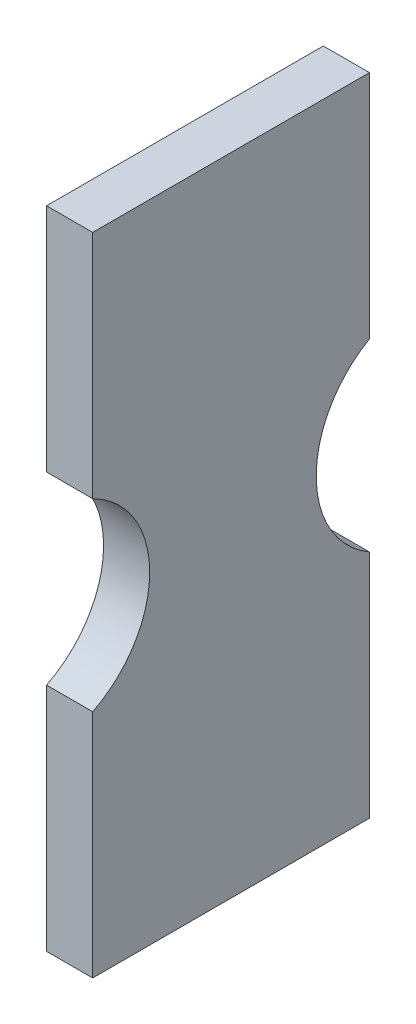
ISO-10303-21;
HEADER;
FILE_DESCRIPTION(('STEP AP214'),'2;1');
FILE_NAME('part.step','',(''),(''),'','','');
FILE_SCHEMA(('AUTOMOTIVE_DESIGN { 1 0 10303 214 1 1 1 1 }'));
ENDSEC;
DATA;
#1=APPLICATION_CONTEXT('core data for automotive mechanical design processes');
#2=APPLICATION_PROTOCOL_DEFINITION('international standard','automotive_design',2000,#1);
#3=PRODUCT_CONTEXT('',#1,'mechanical');
#4=PRODUCT('Part','Part','',(#3));
#5=PRODUCT_RELATED_PRODUCT_CATEGORY('part','',(#4));
#6=PRODUCT_DEFINITION_FORMATION('','',#4);
#7=PRODUCT_DEFINITION_CONTEXT('part definition',#1,'design');
#8=PRODUCT_DEFINITION('design','',#6,#7);
#9=PRODUCT_DEFINITION_SHAPE('','',#8);
#10=(LENGTH_UNIT() NAMED_UNIT(*) SI_UNIT(.MILLI.,.METRE.));
#11=(NAMED_UNIT(*) PLANE_ANGLE_UNIT() SI_UNIT($,.RADIAN.));
#12=(NAMED_UNIT(*) SI_UNIT($,.STERADIAN.) SOLID_ANGLE_UNIT());
#13=UNCERTAINTY_MEASURE_WITH_UNIT(LENGTH_MEASURE(1.E-05),#10,'distance_accuracy_value','');
#14=(GEOMETRIC_REPRESENTATION_CONTEXT(3) GLOBAL_UNCERTAINTY_ASSIGNED_CONTEXT((#13)) GLOBAL_UNIT_ASSIGNED_CONTEXT((#10,
#11,#12)) REPRESENTATION_CONTEXT('',''));
#15=CARTESIAN_POINT('',(0.,0.,0.));
#16=DIRECTION('',(0.,0.,1.));
#17=DIRECTION('',(1.,0.,0.));
#18=AXIS2_PLACEMENT_3D('',#15,#16,#17);
#19=CARTESIAN_POINT('',(6.35,0.,0.));
#20=DIRECTION('',(0.,0.,1.));
#21=DIRECTION('',(1.,0.,0.));
#22=AXIS2_PLACEMENT_3D('',#19,#20,#21);
#23=PLANE('',#22);
#24=DIRECTION('',(0.,1.,0.));
#25=VECTOR('',#24,1.);
#26=CARTESIAN_POINT('',(0.,0.,0.));
#27=LINE('',#26,#25);
#28=CARTESIAN_POINT('',(0.,0.,0.));
#29=VERTEX_POINT('',#28);
#30=CARTESIAN_POINT('',(0.,31.75,0.));
#31=VERTEX_POINT('',#30);
#32=EDGE_CURVE('E140',#29,#31,#27,.T.);
#33=ORIENTED_EDGE('',*,*,#32,.T.);
#34=DIRECTION('',(1.,0.,0.));
#35=VECTOR('',#34,1.);
#36=CARTESIAN_POINT('',(0.,31.75,0.));
#37=LINE('',#36,#35);
#38=CARTESIAN_POINT('',(6.35,31.75,0.));
#39=VERTEX_POINT('',#38);
#40=EDGE_CURVE('E61',#31,#39,#37,.T.);
#41=ORIENTED_EDGE('',*,*,#40,.T.);
#42=DIRECTION('',(0.,1.,0.));
#43=VECTOR('',#42,1.);
#44=CARTESIAN_POINT('',(6.35,0.,0.));
#45=LINE('',#44,#43);
#46=CARTESIAN_POINT('',(6.35,0.,0.));
#47=VERTEX_POINT('',#46);
#48=EDGE_CURVE('E199',#47,#39,#45,.T.);
#49=ORIENTED_EDGE('',*,*,#48,.F.);
#50=DIRECTION('',(-1.,0.,0.));
#51=VECTOR('',#50,1.);
#52=CARTESIAN_POINT('',(6.35,0.,0.));
#53=LINE('',#52,#51);
#54=EDGE_CURVE('E11',#47,#29,#53,.T.);
#55=ORIENTED_EDGE('',*,*,#54,.T.);
#56=EDGE_LOOP('',(#33,#41,#49,#55));
#57=FACE_BOUND('',#56,.T.);
#58=ADVANCED_FACE('F45',(#57),#23,.F.);
#59=CARTESIAN_POINT('',(6.35,0.,38.1));
#60=DIRECTION('',(0.,0.,-1.));
#61=DIRECTION('',(-1.,0.,0.));
#62=AXIS2_PLACEMENT_3D('',#59,#60,#61);
#63=PLANE('',#62);
#64=DIRECTION('',(0.,-1.,0.));
#65=VECTOR('',#64,1.);
#66=CARTESIAN_POINT('',(0.,0.,38.1));
#67=LINE('',#66,#65);
#68=CARTESIAN_POINT('',(0.,88.9,38.1));
#69=VERTEX_POINT('',#68);
#70=CARTESIAN_POINT('',(0.,57.15,38.1));
#71=VERTEX_POINT('',#70);
#72=EDGE_CURVE('E134',#69,#71,#67,.T.);
#73=ORIENTED_EDGE('',*,*,#72,.T.);
#74=DIRECTION('',(1.,0.,0.));
#75=VECTOR('',#74,1.);
#76=CARTESIAN_POINT('',(0.,57.15,38.1));
#77=LINE('',#76,#75);
#78=CARTESIAN_POINT('',(6.35,57.15,38.1));
#79=VERTEX_POINT('',#78);
#80=EDGE_CURVE('E69',#71,#79,#77,.T.);
#81=ORIENTED_EDGE('',*,*,#80,.T.);
#82=DIRECTION('',(0.,-1.,0.));
#83=VECTOR('',#82,1.);
#84=CARTESIAN_POINT('',(6.35,0.,38.1));
#85=LINE('',#84,#83);
#86=CARTESIAN_POINT('',(6.35,88.9,38.1));
#87=VERTEX_POINT('',#86);
#88=EDGE_CURVE('E148',#87,#79,#85,.T.);
#89=ORIENTED_EDGE('',*,*,#88,.F.);
#90=DIRECTION('',(-1.,0.,0.));
#91=VECTOR('',#90,1.);
#92=CARTESIAN_POINT('',(6.35,88.9,38.1));
#93=LINE('',#92,#91);
#94=EDGE_CURVE('E147',#87,#69,#93,.T.);
#95=ORIENTED_EDGE('',*,*,#94,.T.);
#96=EDGE_LOOP('',(#73,#81,#89,#95));
#97=FACE_BOUND('',#96,.T.);
#98=ADVANCED_FACE('F165',(#97),#63,.F.);
#99=CARTESIAN_POINT('',(6.35,0.,0.));
#100=DIRECTION('',(0.,1.,0.));
#101=DIRECTION('',(0.,0.,1.));
#102=AXIS2_PLACEMENT_3D('',#99,#100,#101);
#103=PLANE('',#102);
#104=DIRECTION('',(0.,0.,-1.));
#105=VECTOR('',#104,1.);
#106=CARTESIAN_POINT('',(0.,0.,0.));
#107=LINE('',#106,#105);
#108=CARTESIAN_POINT('',(0.,0.,38.1));
#109=VERTEX_POINT('',#108);
#110=EDGE_CURVE('E128',#109,#29,#107,.T.);
#111=ORIENTED_EDGE('',*,*,#110,.T.);
#112=ORIENTED_EDGE('',*,*,#54,.F.);
#113=DIRECTION('',(0.,0.,-1.));
#114=VECTOR('',#113,1.);
#115=CARTESIAN_POINT('',(6.35,0.,0.));
#116=LINE('',#115,#114);
#117=CARTESIAN_POINT('',(6.35,0.,38.1));
#118=VERTEX_POINT('',#117);
#119=EDGE_CURVE('E139',#118,#47,#116,.T.);
#120=ORIENTED_EDGE('',*,*,#119,.F.);
#121=DIRECTION('',(-1.,0.,0.));
#122=VECTOR('',#121,1.);
#123=CARTESIAN_POINT('',(6.35,0.,38.1));
#124=LINE('',#123,#122);
#125=EDGE_CURVE('E144',#118,#109,#124,.T.);
#126=ORIENTED_EDGE('',*,*,#125,.T.);
#127=EDGE_LOOP('',(#111,#112,#120,#126));
#128=FACE_BOUND('',#127,.T.);
#129=ADVANCED_FACE('F47',(#128),#103,.F.);
#130=CARTESIAN_POINT('',(6.35,57.15,0.));
#131=VERTEX_POINT('',#130);
#132=CARTESIAN_POINT('',(6.35,88.9,0.));
#133=VERTEX_POINT('',#132);
#134=EDGE_CURVE('E183',#131,#133,#45,.T.);
#135=ORIENTED_EDGE('',*,*,#134,.F.);
#136=DIRECTION('',(1.,0.,0.));
#137=VECTOR('',#136,1.);
#138=CARTESIAN_POINT('',(0.,57.15,0.));
#139=LINE('',#138,#137);
#140=CARTESIAN_POINT('',(0.,57.15,0.));
#141=VERTEX_POINT('',#140);
#142=EDGE_CURVE('E182',#141,#131,#139,.T.);
#143=ORIENTED_EDGE('',*,*,#142,.F.);
#144=CARTESIAN_POINT('',(0.,88.9,0.));
#145=VERTEX_POINT('',#144);
#146=EDGE_CURVE('E163',#141,#145,#27,.T.);
#147=ORIENTED_EDGE('',*,*,#146,.T.);
#148=DIRECTION('',(-1.,0.,0.));
#149=VECTOR('',#148,1.);
#150=CARTESIAN_POINT('',(6.35,88.9,0.));
#151=LINE('',#150,#149);
#152=EDGE_CURVE('E54',#133,#145,#151,.T.);
#153=ORIENTED_EDGE('',*,*,#152,.F.);
#154=EDGE_LOOP('',(#135,#143,#147,#153));
#155=FACE_BOUND('',#154,.T.);
#156=ADVANCED_FACE('F181',(#155),#23,.F.);
#157=CARTESIAN_POINT('',(6.35,88.9,0.));
#158=DIRECTION('',(0.,-1.,0.));
#159=DIRECTION('',(0.,0.,-1.));
#160=AXIS2_PLACEMENT_3D('',#157,#158,#159);
#161=PLANE('',#160);
#162=DIRECTION('',(0.,0.,1.));
#163=VECTOR('',#162,1.);
#164=CARTESIAN_POINT('',(0.,88.9,0.));
#165=LINE('',#164,#163);
#166=EDGE_CURVE('E135',#145,#69,#165,.T.);
#167=ORIENTED_EDGE('',*,*,#166,.T.);
#168=ORIENTED_EDGE('',*,*,#94,.F.);
#169=DIRECTION('',(0.,0.,1.));
#170=VECTOR('',#169,1.);
#171=CARTESIAN_POINT('',(6.35,88.9,0.));
#172=LINE('',#171,#170);
#173=EDGE_CURVE('E159',#133,#87,#172,.T.);
#174=ORIENTED_EDGE('',*,*,#173,.F.);
#175=ORIENTED_EDGE('',*,*,#152,.T.);
#176=EDGE_LOOP('',(#167,#168,#174,#175));
#177=FACE_BOUND('',#176,.T.);
#178=ADVANCED_FACE('F157',(#177),#161,.F.);
#179=CARTESIAN_POINT('',(6.35,31.75,38.1));
#180=VERTEX_POINT('',#179);
#181=EDGE_CURVE('E126',#180,#118,#85,.T.);
#182=ORIENTED_EDGE('',*,*,#181,.F.);
#183=DIRECTION('',(1.,0.,0.));
#184=VECTOR('',#183,1.);
#185=CARTESIAN_POINT('',(0.,31.75,38.1));
#186=LINE('',#185,#184);
#187=CARTESIAN_POINT('',(0.,31.75,38.1));
#188=VERTEX_POINT('',#187);
#189=EDGE_CURVE('E111',#188,#180,#186,.T.);
#190=ORIENTED_EDGE('',*,*,#189,.F.);
#191=EDGE_CURVE('E124',#188,#109,#67,.T.);
#192=ORIENTED_EDGE('',*,*,#191,.T.);
#193=ORIENTED_EDGE('',*,*,#125,.F.);
#194=EDGE_LOOP('',(#182,#190,#192,#193));
#195=FACE_BOUND('',#194,.T.);
#196=ADVANCED_FACE('F122',(#195),#63,.F.);
#197=CARTESIAN_POINT('',(6.35,0.,0.));
#198=DIRECTION('',(-1.,0.,0.));
#199=DIRECTION('',(0.,0.,1.));
#200=AXIS2_PLACEMENT_3D('',#197,#198,#199);
#201=PLANE('',#200);
#202=ORIENTED_EDGE('',*,*,#88,.T.);
#203=CARTESIAN_POINT('',(6.35,44.45,44.45));
#204=DIRECTION('',(1.,0.,0.));
#205=DIRECTION('',(0.,0.,-1.));
#206=AXIS2_PLACEMENT_3D('',#203,#204,#205);
#207=CIRCLE('',#206,14.1990316571237);
#208=EDGE_CURVE('E118',#180,#79,#207,.T.);
#209=ORIENTED_EDGE('',*,*,#208,.F.);
#210=ORIENTED_EDGE('',*,*,#181,.T.);
#211=ORIENTED_EDGE('',*,*,#119,.T.);
#212=ORIENTED_EDGE('',*,*,#48,.T.);
#213=CARTESIAN_POINT('',(6.35,44.45,-7.34406322096139));
#214=DIRECTION('',(1.,0.,0.));
#215=DIRECTION('',(0.,0.,1.));
#216=AXIS2_PLACEMENT_3D('',#213,#214,#215);
#217=CIRCLE('',#216,14.6705577465029);
#218=EDGE_CURVE('E192',#131,#39,#217,.T.);
#219=ORIENTED_EDGE('',*,*,#218,.F.);
#220=ORIENTED_EDGE('',*,*,#134,.T.);
#221=ORIENTED_EDGE('',*,*,#173,.T.);
#222=EDGE_LOOP('',(#202,#209,#210,#211,#212,#219,#220,#221));
#223=FACE_BOUND('',#222,.T.);
#224=ADVANCED_FACE('F204',(#223),#201,.F.);
#225=CARTESIAN_POINT('',(0.,0.,0.));
#226=DIRECTION('',(-1.,0.,0.));
#227=DIRECTION('',(0.,0.,1.));
#228=AXIS2_PLACEMENT_3D('',#225,#226,#227);
#229=PLANE('',#228);
#230=CARTESIAN_POINT('',(0.,44.45,44.45));
#231=DIRECTION('',(1.,0.,0.));
#232=DIRECTION('',(0.,0.,-1.));
#233=AXIS2_PLACEMENT_3D('',#230,#231,#232);
#234=CIRCLE('',#233,14.1990316571237);
#235=EDGE_CURVE('E108',#188,#71,#234,.T.);
#236=ORIENTED_EDGE('',*,*,#235,.T.);
#237=ORIENTED_EDGE('',*,*,#72,.F.);
#238=ORIENTED_EDGE('',*,*,#166,.F.);
#239=ORIENTED_EDGE('',*,*,#146,.F.);
#240=CARTESIAN_POINT('',(0.,44.45,-7.34406322096139));
#241=DIRECTION('',(1.,0.,0.));
#242=DIRECTION('',(0.,0.,1.));
#243=AXIS2_PLACEMENT_3D('',#240,#241,#242);
#244=CIRCLE('',#243,14.6705577465029);
#245=EDGE_CURVE('E188',#141,#31,#244,.T.);
#246=ORIENTED_EDGE('',*,*,#245,.T.);
#247=ORIENTED_EDGE('',*,*,#32,.F.);
#248=ORIENTED_EDGE('',*,*,#110,.F.);
#249=ORIENTED_EDGE('',*,*,#191,.F.);
#250=EDGE_LOOP('',(#236,#237,#238,#239,#246,#247,#248,#249));
#251=FACE_BOUND('',#250,.T.);
#252=ADVANCED_FACE('F131',(#251),#229,.T.);
#253=CARTESIAN_POINT('',(0.,44.45,-7.34406322096139));
#254=DIRECTION('',(1.,0.,0.));
#255=DIRECTION('',(0.,0.,-1.));
#256=AXIS2_PLACEMENT_3D('',#253,#254,#255);
#257=CYLINDRICAL_SURFACE('',#256,14.6705577465029);
#258=ORIENTED_EDGE('',*,*,#218,.T.);
#259=ORIENTED_EDGE('',*,*,#40,.F.);
#260=ORIENTED_EDGE('',*,*,#245,.F.);
#261=ORIENTED_EDGE('',*,*,#142,.T.);
#262=EDGE_LOOP('',(#258,#259,#260,#261));
#263=FACE_BOUND('',#262,.T.);
#264=ADVANCED_FACE('F205',(#263),#257,.F.);
#265=CARTESIAN_POINT('',(0.,44.45,44.45));
#266=DIRECTION('',(1.,0.,0.));
#267=DIRECTION('',(0.,0.,-1.));
#268=AXIS2_PLACEMENT_3D('',#265,#266,#267);
#269=CYLINDRICAL_SURFACE('',#268,14.1990316571237);
#270=ORIENTED_EDGE('',*,*,#208,.T.);
#271=ORIENTED_EDGE('',*,*,#80,.F.);
#272=ORIENTED_EDGE('',*,*,#235,.F.);
#273=ORIENTED_EDGE('',*,*,#189,.T.);
#274=EDGE_LOOP('',(#270,#271,#272,#273));
#275=FACE_BOUND('',#274,.T.);
#276=ADVANCED_FACE('F110',(#275),#269,.F.);
#277=CLOSED_SHELL('',(#58,#98,#129,#156,#178,#196,#224,#252,#264,#276));
#278=MANIFOLD_SOLID_BREP('B2',#277);
#279=ADVANCED_BREP_SHAPE_REPRESENTATION('',(#18,#278),#14);
#280=SHAPE_DEFINITION_REPRESENTATION(#9,#279);
ENDSEC;
END-ISO-10303-21;
